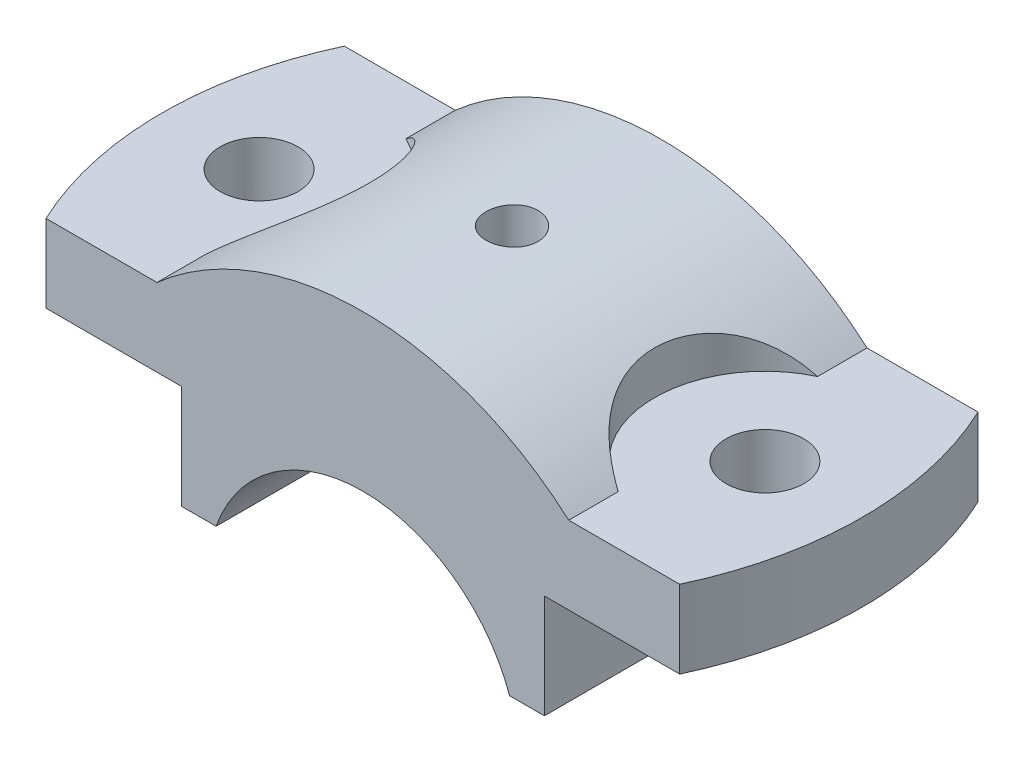
ISO-10303-21;
HEADER;
FILE_DESCRIPTION(('STEP AP214'),'2;1');
FILE_NAME('part.step','',(''),(''),'','','');
FILE_SCHEMA(('AUTOMOTIVE_DESIGN { 1 0 10303 214 1 1 1 1 }'));
ENDSEC;
DATA;
#1=APPLICATION_CONTEXT('core data for automotive mechanical design processes');
#2=APPLICATION_PROTOCOL_DEFINITION('international standard','automotive_design',2000,#1);
#3=PRODUCT_CONTEXT('',#1,'mechanical');
#4=PRODUCT('Part','Part','',(#3));
#5=PRODUCT_RELATED_PRODUCT_CATEGORY('part','',(#4));
#6=PRODUCT_DEFINITION_FORMATION('','',#4);
#7=PRODUCT_DEFINITION_CONTEXT('part definition',#1,'design');
#8=PRODUCT_DEFINITION('design','',#6,#7);
#9=PRODUCT_DEFINITION_SHAPE('','',#8);
#10=(LENGTH_UNIT() NAMED_UNIT(*) SI_UNIT(.MILLI.,.METRE.));
#11=(NAMED_UNIT(*) PLANE_ANGLE_UNIT() SI_UNIT($,.RADIAN.));
#12=(NAMED_UNIT(*) SI_UNIT($,.STERADIAN.) SOLID_ANGLE_UNIT());
#13=UNCERTAINTY_MEASURE_WITH_UNIT(LENGTH_MEASURE(1.E-05),#10,'distance_accuracy_value','');
#14=(GEOMETRIC_REPRESENTATION_CONTEXT(3) GLOBAL_UNCERTAINTY_ASSIGNED_CONTEXT((#13)) GLOBAL_UNIT_ASSIGNED_CONTEXT((#10,
#11,#12)) REPRESENTATION_CONTEXT('',''));
#15=CARTESIAN_POINT('',(0.,0.,0.));
#16=DIRECTION('',(0.,0.,1.));
#17=DIRECTION('',(1.,0.,0.));
#18=AXIS2_PLACEMENT_3D('',#15,#16,#17);
#19=CARTESIAN_POINT('',(0.,-8.,46.));
#20=DIRECTION('',(0.,0.,-1.));
#21=DIRECTION('',(-1.,0.,0.));
#22=AXIS2_PLACEMENT_3D('',#19,#20,#21);
#23=CYLINDRICAL_SURFACE('',#22,48.);
#24=CARTESIAN_POINT('',(0.,40.,27.));
#25=CARTESIAN_POINT('',(-0.224264359684817,39.9999978164606,26.9999902046949));
#26=CARTESIAN_POINT('',(-0.448681388720903,39.9984115417359,26.9810761207558));
#27=CARTESIAN_POINT('',(-0.891306282801559,39.99223609313,26.9059025925797));
#28=CARTESIAN_POINT('',(-1.10950682090092,39.9876435172678,26.8496008387804));
#29=CARTESIAN_POINT('',(-1.53322409005704,39.9759744498442,26.7012913847625));
#30=CARTESIAN_POINT('',(-1.73874792169846,39.9688993639394,26.6093038875607));
#31=CARTESIAN_POINT('',(-2.1313889336643,39.9530587097885,26.392270272512));
#32=CARTESIAN_POINT('',(-2.31851003954155,39.9442935032543,26.26723122609));
#33=CARTESIAN_POINT('',(-2.66955999986236,39.9260311946685,25.987299733576));
#34=CARTESIAN_POINT('',(-2.83343548966465,39.9165324834631,25.8323404642573));
#35=CARTESIAN_POINT('',(-3.13288453414622,39.8978872321267,25.4971084166003));
#36=CARTESIAN_POINT('',(-3.26845684548602,39.8887407074816,25.3168345267895));
#37=CARTESIAN_POINT('',(-3.50763168956091,39.8718181064497,24.9357675316039));
#38=CARTESIAN_POINT('',(-3.61118733180617,39.8640440472037,24.7349448983889));
#39=CARTESIAN_POINT('',(-3.78308973509538,39.8507649779309,24.3186868177761));
#40=CARTESIAN_POINT('',(-3.85143711804967,39.8452599278253,24.103251628567));
#41=CARTESIAN_POINT('',(-3.95082811927428,39.8371556826529,23.6644184324753));
#42=CARTESIAN_POINT('',(-3.9819586615591,39.8345497174488,23.4410402400296));
#43=CARTESIAN_POINT('',(-4.00630083206171,39.832517292859,22.9922151842185));
#44=CARTESIAN_POINT('',(-3.99951317191816,39.8330907738024,22.766768359756));
#45=CARTESIAN_POINT('',(-3.94828345685939,39.8373462944655,22.3208013379579));
#46=CARTESIAN_POINT('',(-3.90393587215223,39.8410205351141,22.1002702036943));
#47=CARTESIAN_POINT('',(-3.77899194153176,39.8510513427746,21.6697925304282));
#48=CARTESIAN_POINT('',(-3.69839524158714,39.857407935984,21.4598460948246));
#49=CARTESIAN_POINT('',(-3.50313515260813,39.8720961882741,21.0561963764876));
#50=CARTESIAN_POINT('',(-3.38842937902877,39.8804303020386,20.86251368965));
#51=CARTESIAN_POINT('',(-3.12823777565339,39.8981322745552,20.4971146447208));
#52=CARTESIAN_POINT('',(-2.98275132249017,39.9075001542413,20.3253987316111));
#53=CARTESIAN_POINT('',(-2.66459832890545,39.9262488164658,20.0082583228737));
#54=CARTESIAN_POINT('',(-2.4918501175623,39.9356295510027,19.862915743483));
#55=CARTESIAN_POINT('',(-2.124362225487,39.9533196747934,19.6032811064458));
#56=CARTESIAN_POINT('',(-1.92962253006135,39.9616290633314,19.4889890695458));
#57=CARTESIAN_POINT('',(-1.5236263730714,39.9762418323856,19.2947049493252));
#58=CARTESIAN_POINT('',(-1.31236816723629,39.9825450006977,19.2147164940874));
#59=CARTESIAN_POINT('',(-0.879356276078326,39.9924326964719,19.0913674701947));
#60=CARTESIAN_POINT('',(-0.657602808675419,39.9960172803554,19.048006141379));
#61=CARTESIAN_POINT('',(-0.210605200657003,40.000056677722,18.9992449438337));
#62=CARTESIAN_POINT('',(0.0146265164607844,40.0005208196801,18.9937319275724));
#63=CARTESIAN_POINT('',(0.462811010013214,39.998291951148,19.0205274425093));
#64=CARTESIAN_POINT('',(0.685763807685653,39.995598970107,19.0528356209178));
#65=CARTESIAN_POINT('',(1.1227390248988,39.9873647136528,19.1542626344404));
#66=CARTESIAN_POINT('',(1.33677370055889,39.9818274966968,19.2233290241032));
#67=CARTESIAN_POINT('',(1.75021666032996,39.968526804494,19.3962583511281));
#68=CARTESIAN_POINT('',(1.94962471313253,39.9607632940497,19.500121838634));
#69=CARTESIAN_POINT('',(2.32866887320763,39.9438570557453,19.7399813968654));
#70=CARTESIAN_POINT('',(2.50825740208588,39.9347111287495,19.8760524255793));
#71=CARTESIAN_POINT('',(2.84208437937449,39.9160783455879,20.1763562282019));
#72=CARTESIAN_POINT('',(2.99632238725753,39.9065914835011,20.3405894913971));
#73=CARTESIAN_POINT('',(3.27545818182041,39.8883184486329,20.6930467687934));
#74=CARTESIAN_POINT('',(3.40028213293455,39.8795340749689,20.8813293647896));
#75=CARTESIAN_POINT('',(3.61654025135807,39.8636860697728,21.2762490514537));
#76=CARTESIAN_POINT('',(3.70797475203985,39.8566224210606,21.4828859588398));
#77=CARTESIAN_POINT('',(3.85473270976226,39.8450257139576,21.908387162157));
#78=CARTESIAN_POINT('',(3.91010136579716,39.8404894891454,22.1272357788573));
#79=CARTESIAN_POINT('',(3.98330307964061,39.834450627634,22.5711627994977));
#80=CARTESIAN_POINT('',(4.00113685827306,39.8329479326787,22.7962410837184));
#81=CARTESIAN_POINT('',(3.99875425156372,39.8331471180078,23.2455045040836));
#82=CARTESIAN_POINT('',(3.97865387910956,39.8348392277228,23.4696902689458));
#83=CARTESIAN_POINT('',(3.90121545318012,39.8412166032923,23.9114901342034));
#84=CARTESIAN_POINT('',(3.84387734291051,39.8459018737118,24.1291042245754));
#85=CARTESIAN_POINT('',(3.69362044006825,39.8577350852682,24.5515910530665));
#86=CARTESIAN_POINT('',(3.60070373602613,39.8648828818476,24.7564645382628));
#87=CARTESIAN_POINT('',(3.381940235789,39.8808359950028,25.1477233622947));
#88=CARTESIAN_POINT('',(3.25609395645823,39.8896412855619,25.3341089912533));
#89=CARTESIAN_POINT('',(2.97460776848979,39.9079492679473,25.683694956052));
#90=CARTESIAN_POINT('',(2.81888197496583,39.9174539202297,25.8468260346294));
#91=CARTESIAN_POINT('',(2.48221290236986,39.9360718003871,26.1447007408133));
#92=CARTESIAN_POINT('',(2.30126353056437,39.945184932993,26.2794374899841));
#93=CARTESIAN_POINT('',(1.91893509211766,39.962009393691,26.5168794416702));
#94=CARTESIAN_POINT('',(1.71751862508215,39.9697180809242,26.6195245546253));
#95=CARTESIAN_POINT('',(1.30038300798293,39.982834100652,26.7894072122051));
#96=CARTESIAN_POINT('',(1.0846806216546,39.9882440771303,26.8566854571524));
#97=CARTESIAN_POINT('',(0.723088192386718,39.994764309354,26.9367903300082));
#98=CARTESIAN_POINT('',(0.579523577753882,39.9967187550781,26.96046245007));
#99=CARTESIAN_POINT('',(0.29066068600465,39.9993373063453,26.9920704387088));
#100=CARTESIAN_POINT('',(0.14536241349218,40.0000014153143,27.0000063490659));
#101=CARTESIAN_POINT('',(0.,40.,27.));
#102=B_SPLINE_CURVE_WITH_KNOTS('',3,(#24,#25,#26,#27,#28,#29,#30,#31,#32,#33,#34,#35,#36,#37,
#38,#39,#40,#41,#42,#43,#44,#45,#46,#47,#48,#49,#50,#51,#52,#53,#54,#55,#56,#57,#58,#59,#60,#61,
#62,#63,#64,#65,#66,#67,#68,#69,#70,#71,#72,#73,#74,#75,#76,#77,#78,#79,#80,#81,#82,#83,#84,#85,
#86,#87,#88,#89,#90,#91,#92,#93,#94,#95,#96,#97,#98,#99,#100,#101),.UNSPECIFIED.,.T.,.F.,(4,2,2,
2,2,2,2,2,2,2,2,2,2,2,2,2,2,2,2,2,2,2,2,2,2,2,2,2,2,2,2,2,2,2,2,2,2,2,4),(0.,0.672262347200557,
1.34528675599134,2.01793069555582,2.69043083833672,3.36445067514306,4.03850011495726,
4.71353211804365,5.38855219711603,6.06199259326345,6.73542035050476,7.40715932441159,
8.07890485907996,8.75148862995597,9.4240860232344,10.098738037406,10.7733905023458,
11.448114303618,12.1228241013014,12.7955159722867,13.4682015685688,14.1399299612314,
14.8116689744549,15.4849869989971,16.15831672285,16.8333190596481,17.5083146567931,
18.1824626896371,18.8565977759503,19.5286745153011,20.2007522796936,20.8727905979009,
21.5448183683942,22.2188075465856,22.8929598092992,23.5683669225021,24.2429950636714,
24.6787394542665,25.1144826879498),.UNSPECIFIED.);
#103=CARTESIAN_POINT('',(0.,40.,27.));
#104=VERTEX_POINT('',#103);
#105=EDGE_CURVE('E189',#104,#104,#102,.T.);
#106=ORIENTED_EDGE('',*,*,#105,.T.);
#107=EDGE_LOOP('',(#106));
#108=FACE_BOUND('',#107,.T.);
#109=DIRECTION('',(0.,0.,-1.));
#110=VECTOR('',#109,1.);
#111=CARTESIAN_POINT('',(-31.7490157327751,28.,46.));
#112=LINE('',#111,#110);
#113=CARTESIAN_POINT('',(-31.7490157327751,28.,7.62393980382305));
#114=VERTEX_POINT('',#113);
#115=CARTESIAN_POINT('',(-31.7490157327751,28.,0.));
#116=VERTEX_POINT('',#115);
#117=EDGE_CURVE('E154',#114,#116,#112,.T.);
#118=ORIENTED_EDGE('',*,*,#117,.F.);
#119=CARTESIAN_POINT('',(-31.7490157327751,28.,7.62393980382304));
#120=CARTESIAN_POINT('',(-31.5666993606049,28.1607910344815,7.70991687292432));
#121=CARTESIAN_POINT('',(-31.3842407385664,28.3192382806885,7.799923567823));
#122=CARTESIAN_POINT('',(-31.0194382984915,28.6312986785064,7.98824476927104));
#123=CARTESIAN_POINT('',(-30.83709449581,28.7849112802083,8.08656021623286));
#124=CARTESIAN_POINT('',(-30.2906545114745,29.2384242405059,8.39444840414579));
#125=CARTESIAN_POINT('',(-29.9273932433293,29.5307855559238,8.61684933510149));
#126=CARTESIAN_POINT('',(-29.2055877678829,30.0952057641667,9.09825010824211));
#127=CARTESIAN_POINT('',(-28.8470773519233,30.3671527207168,9.35743198365531));
#128=CARTESIAN_POINT('',(-28.1414563178619,30.8876660950044,9.91209322117403));
#129=CARTESIAN_POINT('',(-27.7943424142726,31.1362392903486,10.2075620036307));
#130=CARTESIAN_POINT('',(-27.114437272857,31.6103537782901,10.8365659071297));
#131=CARTESIAN_POINT('',(-26.7817440960143,31.8357484531289,11.1703180960102));
#132=CARTESIAN_POINT('',(-26.1381758530123,32.2609560521935,11.8734281889072));
#133=CARTESIAN_POINT('',(-25.8273031949564,32.4607661549158,12.2427900121453));
#134=CARTESIAN_POINT('',(-25.2335249148576,32.8337098769773,13.01399375225));
#135=CARTESIAN_POINT('',(-24.9505424988563,33.0069175240425,13.4157406115368));
#136=CARTESIAN_POINT('',(-24.4165226257608,33.3271148139075,14.2497280213662));
#137=CARTESIAN_POINT('',(-24.1654802670831,33.4741084809499,14.6819638771439));
#138=CARTESIAN_POINT('',(-23.7269538102758,33.7263466257882,15.5212678567218));
#139=CARTESIAN_POINT('',(-23.5354718167671,33.8344606926746,15.9253930890385));
#140=CARTESIAN_POINT('',(-23.1835604410675,34.0305023424913,16.7516546435088));
#141=CARTESIAN_POINT('',(-23.0231288276401,34.1184313759742,17.1737896688415));
#142=CARTESIAN_POINT('',(-22.7354708993116,34.2744033380662,18.0330593307288));
#143=CARTESIAN_POINT('',(-22.608263014144,34.3424352319097,18.4702021408734));
#144=CARTESIAN_POINT('',(-22.3889311500728,34.4588178093571,19.3557653801655));
#145=CARTESIAN_POINT('',(-22.2968060905276,34.5071690991774,19.8041854614902));
#146=CARTESIAN_POINT('',(-22.1535573681311,34.5819913104556,20.6801355748953));
#147=CARTESIAN_POINT('',(-22.1002179585565,34.6096478774008,21.1072039547406));
#148=CARTESIAN_POINT('',(-22.0260840023336,34.6480173220226,21.9648989915092));
#149=CARTESIAN_POINT('',(-22.0052877863416,34.6587310688026,22.3955254647765));
#150=CARTESIAN_POINT('',(-21.9964874817101,34.6632694542849,23.2570337519885));
#151=CARTESIAN_POINT('',(-22.0084707600267,34.6571005994522,23.6879154035977));
#152=CARTESIAN_POINT('',(-22.065059537599,34.6278566152432,24.5469567479689));
#153=CARTESIAN_POINT('',(-22.1096651361626,34.6047814344012,24.9751164324407));
#154=CARTESIAN_POINT('',(-22.2301596888934,34.5420325739506,25.8199476406009));
#155=CARTESIAN_POINT('',(-22.3056259308811,34.5025830752487,26.2366962152239));
#156=CARTESIAN_POINT('',(-22.4869158657054,34.4069464217796,27.0615720498306));
#157=CARTESIAN_POINT('',(-22.5927390819872,34.3507595297616,27.4696994450449));
#158=CARTESIAN_POINT('',(-22.8334963082055,34.2214412118201,28.2745223886822));
#159=CARTESIAN_POINT('',(-22.968430619134,34.1483096106976,28.6712178188572));
#160=CARTESIAN_POINT('',(-23.2658059297839,33.9848905587104,29.4505094660615));
#161=CARTESIAN_POINT('',(-23.4282471429062,33.8946029747475,29.8331055736788));
#162=CARTESIAN_POINT('',(-23.7802108235913,33.6958360657888,30.5849716873719));
#163=CARTESIAN_POINT('',(-23.9699550727257,33.5872063549857,30.9540980563005));
#164=CARTESIAN_POINT('',(-24.3731485080022,33.3521952355227,31.6732437269405));
#165=CARTESIAN_POINT('',(-24.5865977528721,33.2258137828835,32.023262981312));
#166=CARTESIAN_POINT('',(-25.0346129932482,32.9552998874379,32.7022362238959));
#167=CARTESIAN_POINT('',(-25.2691774101921,32.8111687712936,33.0311917836809));
#168=CARTESIAN_POINT('',(-25.7566603032743,32.5052741270816,33.6665029899036));
#169=CARTESIAN_POINT('',(-26.0095789285025,32.3435104557808,33.9728584527217));
#170=CARTESIAN_POINT('',(-26.5418842805158,31.9954208539865,34.574253346598));
#171=CARTESIAN_POINT('',(-26.8219376643438,31.8083462352715,34.8682688661705));
#172=CARTESIAN_POINT('',(-27.3955194624364,31.4158125971757,35.4296869015499));
#173=CARTESIAN_POINT('',(-27.6890490642934,31.2103519560056,35.6970870652737));
#174=CARTESIAN_POINT('',(-28.2863824379904,30.7816416595243,36.205005176795));
#175=CARTESIAN_POINT('',(-28.5901897214681,30.5583858879776,36.4455138130625));
#176=CARTESIAN_POINT('',(-29.2047776474053,30.0950011657592,36.8996257253553));
#177=CARTESIAN_POINT('',(-29.515556781803,29.8548758405909,37.113234755093));
#178=CARTESIAN_POINT('',(-30.1465409740783,29.3543930550497,37.5175420543303));
#179=CARTESIAN_POINT('',(-30.4668164417767,29.0937608790559,37.7077886938376));
#180=CARTESIAN_POINT('',(-31.1079315091615,28.5577863535064,38.0615091701432));
#181=CARTESIAN_POINT('',(-31.4287665224092,28.282490555825,38.2250617322872));
#182=CARTESIAN_POINT('',(-31.7490157327751,28.,38.3760601961769));
#183=B_SPLINE_CURVE_WITH_KNOTS('',3,(#119,#120,#121,#122,#123,#124,#125,#126,#127,#128,#129,
#130,#131,#132,#133,#134,#135,#136,#137,#138,#139,#140,#141,#142,#143,#144,#145,#146,#147,#148,
#149,#150,#151,#152,#153,#154,#155,#156,#157,#158,#159,#160,#161,#162,#163,#164,#165,#166,#167,
#168,#169,#170,#171,#172,#173,#174,#175,#176,#177,#178,#179,#180,#181,#182),.UNSPECIFIED.,.F.,
.F.,(4,2,2,2,2,2,2,2,2,2,2,2,2,2,2,2,2,2,2,2,2,2,2,2,2,2,2,2,2,2,2,4),(0.,0.773458025682369,
1.5470037114875,3.09512332277503,4.65119082007948,6.20680570955184,7.77172305062613,
9.33681282467527,10.8974652129592,12.4578778108564,13.8363264835486,15.2146760660573,
16.5937886249588,17.9728587002062,19.2651269606079,20.5573289303254,21.8490329624022,
23.1407409266611,24.4153187748838,25.6898766154092,26.9644476347566,28.2390285427914,
29.5246179289053,30.8102105000725,32.0957070405173,33.381214024115,34.7209972321288,
36.060898736084,37.4012627703214,38.7413396176214,40.1042161588979,41.4629977344696),.UNSPECIFIED.);
#184=CARTESIAN_POINT('',(-31.7490157327751,28.,38.3760601961769));
#185=VERTEX_POINT('',#184);
#186=EDGE_CURVE('E11',#114,#185,#183,.T.);
#187=ORIENTED_EDGE('',*,*,#186,.T.);
#188=CARTESIAN_POINT('',(-31.7490157327751,28.,46.));
#189=VERTEX_POINT('',#188);
#190=EDGE_CURVE('E151',#189,#185,#112,.T.);
#191=ORIENTED_EDGE('',*,*,#190,.F.);
#192=CARTESIAN_POINT('',(0.,-8.,46.));
#193=DIRECTION('',(0.,0.,1.));
#194=DIRECTION('',(-1.,0.,0.));
#195=AXIS2_PLACEMENT_3D('',#192,#193,#194);
#196=CIRCLE('',#195,48.);
#197=CARTESIAN_POINT('',(31.7490157327751,28.,46.));
#198=VERTEX_POINT('',#197);
#199=EDGE_CURVE('E265',#198,#189,#196,.T.);
#200=ORIENTED_EDGE('',*,*,#199,.F.);
#201=DIRECTION('',(0.,0.,-1.));
#202=VECTOR('',#201,1.);
#203=CARTESIAN_POINT('',(31.7490157327751,28.,46.));
#204=LINE('',#203,#202);
#205=CARTESIAN_POINT('',(31.7490157327751,28.,38.3760601961769));
#206=VERTEX_POINT('',#205);
#207=EDGE_CURVE('E162',#198,#206,#204,.T.);
#208=ORIENTED_EDGE('',*,*,#207,.T.);
#209=CARTESIAN_POINT('',(31.7490157327751,28.,7.62393980382304));
#210=CARTESIAN_POINT('',(31.5666993606049,28.1607910344816,7.70991687292431));
#211=CARTESIAN_POINT('',(31.3842407385664,28.3192382806885,7.79992356782299));
#212=CARTESIAN_POINT('',(31.0194382984914,28.6312986785064,7.98824476927103));
#213=CARTESIAN_POINT('',(30.83709449581,28.7849112802083,8.08656021623285));
#214=CARTESIAN_POINT('',(30.2906545114745,29.2384242405059,8.39444840414578));
#215=CARTESIAN_POINT('',(29.9273932433292,29.5307855559239,8.61684933510148));
#216=CARTESIAN_POINT('',(29.2055877678829,30.0952057641667,9.0982501082421));
#217=CARTESIAN_POINT('',(28.8470773519233,30.3671527207169,9.3574319836553));
#218=CARTESIAN_POINT('',(28.1414563178619,30.8876660950044,9.91209322117402));
#219=CARTESIAN_POINT('',(27.7943424142725,31.1362392903486,10.2075620036307));
#220=CARTESIAN_POINT('',(27.1144372728569,31.6103537782901,10.8365659071297));
#221=CARTESIAN_POINT('',(26.7817440960143,31.8357484531289,11.1703180960102));
#222=CARTESIAN_POINT('',(26.1381758530123,32.2609560521935,11.8734281889072));
#223=CARTESIAN_POINT('',(25.8273031949563,32.4607661549158,12.2427900121453));
#224=CARTESIAN_POINT('',(25.2335249148575,32.8337098769773,13.01399375225));
#225=CARTESIAN_POINT('',(24.9505424988563,33.0069175240426,13.4157406115368));
#226=CARTESIAN_POINT('',(24.4165226257608,33.3271148139075,14.2497280213662));
#227=CARTESIAN_POINT('',(24.165480267083,33.4741084809499,14.6819638771439));
#228=CARTESIAN_POINT('',(23.7269538102758,33.7263466257883,15.5212678567218));
#229=CARTESIAN_POINT('',(23.535471816767,33.8344606926746,15.9253930890385));
#230=CARTESIAN_POINT('',(23.1835604410674,34.0305023424913,16.7516546435088));
#231=CARTESIAN_POINT('',(23.0231288276401,34.1184313759742,17.1737896688415));
#232=CARTESIAN_POINT('',(22.7354708993115,34.2744033380662,18.0330593307288));
#233=CARTESIAN_POINT('',(22.608263014144,34.3424352319097,18.4702021408734));
#234=CARTESIAN_POINT('',(22.3889311500727,34.4588178093571,19.3557653801655));
#235=CARTESIAN_POINT('',(22.2968060905276,34.5071690991774,19.8041854614902));
#236=CARTESIAN_POINT('',(22.1535573681311,34.5819913104556,20.6801355748953));
#237=CARTESIAN_POINT('',(22.1002179585565,34.6096478774008,21.1072039547406));
#238=CARTESIAN_POINT('',(22.0260840023336,34.6480173220226,21.9648989915092));
#239=CARTESIAN_POINT('',(22.0052877863416,34.6587310688027,22.3955254647765));
#240=CARTESIAN_POINT('',(21.9964874817101,34.6632694542849,23.2570337519885));
#241=CARTESIAN_POINT('',(22.0084707600267,34.6571005994522,23.6879154035977));
#242=CARTESIAN_POINT('',(22.065059537599,34.6278566152432,24.5469567479689));
#243=CARTESIAN_POINT('',(22.1096651361626,34.6047814344012,24.9751164324407));
#244=CARTESIAN_POINT('',(22.2301596888934,34.5420325739506,25.8199476406009));
#245=CARTESIAN_POINT('',(22.305625930881,34.5025830752487,26.2366962152239));
#246=CARTESIAN_POINT('',(22.4869158657054,34.4069464217796,27.0615720498306));
#247=CARTESIAN_POINT('',(22.5927390819871,34.3507595297616,27.4696994450449));
#248=CARTESIAN_POINT('',(22.8334963082055,34.2214412118201,28.2745223886822));
#249=CARTESIAN_POINT('',(22.968430619134,34.1483096106976,28.6712178188572));
#250=CARTESIAN_POINT('',(23.2658059297839,33.9848905587104,29.4505094660615));
#251=CARTESIAN_POINT('',(23.4282471429062,33.8946029747475,29.8331055736788));
#252=CARTESIAN_POINT('',(23.7802108235912,33.6958360657888,30.5849716873719));
#253=CARTESIAN_POINT('',(23.9699550727257,33.5872063549857,30.9540980563005));
#254=CARTESIAN_POINT('',(24.3731485080021,33.3521952355227,31.6732437269405));
#255=CARTESIAN_POINT('',(24.5865977528721,33.2258137828836,32.023262981312));
#256=CARTESIAN_POINT('',(25.0346129932482,32.955299887438,32.7022362238959));
#257=CARTESIAN_POINT('',(25.269177410192,32.8111687712936,33.0311917836809));
#258=CARTESIAN_POINT('',(25.7566603032743,32.5052741270816,33.6665029899036));
#259=CARTESIAN_POINT('',(26.0095789285024,32.3435104557808,33.9728584527217));
#260=CARTESIAN_POINT('',(26.5418842805157,31.9954208539865,34.574253346598));
#261=CARTESIAN_POINT('',(26.8219376643438,31.8083462352715,34.8682688661705));
#262=CARTESIAN_POINT('',(27.3955194624364,31.4158125971757,35.4296869015499));
#263=CARTESIAN_POINT('',(27.6890490642933,31.2103519560057,35.6970870652737));
#264=CARTESIAN_POINT('',(28.2863824379903,30.7816416595243,36.205005176795));
#265=CARTESIAN_POINT('',(28.5901897214681,30.5583858879776,36.4455138130625));
#266=CARTESIAN_POINT('',(29.2047776474053,30.0950011657593,36.8996257253554));
#267=CARTESIAN_POINT('',(29.515556781803,29.8548758405909,37.113234755093));
#268=CARTESIAN_POINT('',(30.1465409740783,29.3543930550497,37.5175420543303));
#269=CARTESIAN_POINT('',(30.4668164417767,29.0937608790559,37.7077886938376));
#270=CARTESIAN_POINT('',(31.1079315091614,28.5577863535064,38.0615091701432));
#271=CARTESIAN_POINT('',(31.4287665224091,28.282490555825,38.2250617322872));
#272=CARTESIAN_POINT('',(31.7490157327751,28.,38.3760601961769));
#273=B_SPLINE_CURVE_WITH_KNOTS('',3,(#209,#210,#211,#212,#213,#214,#215,#216,#217,#218,#219,
#220,#221,#222,#223,#224,#225,#226,#227,#228,#229,#230,#231,#232,#233,#234,#235,#236,#237,#238,
#239,#240,#241,#242,#243,#244,#245,#246,#247,#248,#249,#250,#251,#252,#253,#254,#255,#256,#257,
#258,#259,#260,#261,#262,#263,#264,#265,#266,#267,#268,#269,#270,#271,#272),.UNSPECIFIED.,.F.,
.F.,(4,2,2,2,2,2,2,2,2,2,2,2,2,2,2,2,2,2,2,2,2,2,2,2,2,2,2,2,2,2,2,4),(0.,0.77345802568237,
1.5470037114875,3.09512332277503,4.65119082007948,6.20680570955184,7.77172305062615,
9.33681282467529,10.8974652129592,12.4578778108564,13.8363264835486,15.2146760660573,
16.5937886249588,17.9728587002062,19.2651269606079,20.5573289303254,21.8490329624022,
23.1407409266611,24.4153187748839,25.6898766154092,26.9644476347566,28.2390285427914,
29.5246179289053,30.8102105000726,32.0957070405173,33.381214024115,34.7209972321288,
36.060898736084,37.4012627703214,38.7413396176214,40.104216158898,41.4629977344696),.UNSPECIFIED.);
#274=CARTESIAN_POINT('',(31.7490157327751,28.,7.62393980382304));
#275=VERTEX_POINT('',#274);
#276=EDGE_CURVE('E52',#275,#206,#273,.T.);
#277=ORIENTED_EDGE('',*,*,#276,.F.);
#278=CARTESIAN_POINT('',(31.7490157327751,28.,0.));
#279=VERTEX_POINT('',#278);
#280=EDGE_CURVE('E160',#275,#279,#204,.T.);
#281=ORIENTED_EDGE('',*,*,#280,.T.);
#282=CARTESIAN_POINT('',(0.,-8.,0.));
#283=DIRECTION('',(0.,0.,1.));
#284=DIRECTION('',(-1.,0.,0.));
#285=AXIS2_PLACEMENT_3D('',#282,#283,#284);
#286=CIRCLE('',#285,48.);
#287=EDGE_CURVE('E287',#279,#116,#286,.T.);
#288=ORIENTED_EDGE('',*,*,#287,.T.);
#289=EDGE_LOOP('',(#118,#187,#191,#200,#208,#277,#281,#288));
#290=FACE_BOUND('',#289,.T.);
#291=ADVANCED_FACE('F37',(#108,#290),#23,.T.);
#292=CARTESIAN_POINT('',(0.,0.,23.));
#293=DIRECTION('',(0.,1.,0.));
#294=DIRECTION('',(0.,0.,1.));
#295=AXIS2_PLACEMENT_3D('',#292,#293,#294);
#296=CYLINDRICAL_SURFACE('',#295,3.);
#297=CARTESIAN_POINT('',(0.,16.,26.));
#298=CARTESIAN_POINT('',(0.167809314666914,15.9999976587571,25.9999928708771));
#299=CARTESIAN_POINT('',(0.335723489163296,15.9982214146588,25.9858725449969));
#300=CARTESIAN_POINT('',(0.666879362507703,15.9913064813363,25.929766694515));
#301=CARTESIAN_POINT('',(0.830115996748493,15.9861642812971,25.8877520744919));
#302=CARTESIAN_POINT('',(1.14707468977566,15.9730967325329,25.7771148273031));
#303=CARTESIAN_POINT('',(1.30080307217537,15.9651732574665,25.7085101098282));
#304=CARTESIAN_POINT('',(1.59453536987164,15.9474244105372,25.5466792592362));
#305=CARTESIAN_POINT('',(1.73454163386764,15.9375993650094,25.4534573497631));
#306=CARTESIAN_POINT('',(1.99765538031758,15.9170838556759,25.2444896601925));
#307=CARTESIAN_POINT('',(2.12067643792455,15.906389376309,25.1286354447845));
#308=CARTESIAN_POINT('',(2.34558335226899,15.885372712117,24.877924611756));
#309=CARTESIAN_POINT('',(2.4474681316707,15.8750505462912,24.7430670261041));
#310=CARTESIAN_POINT('',(2.62753219354073,15.855907667435,24.4576160269212));
#311=CARTESIAN_POINT('',(2.70563051512928,15.8470921261349,24.3069711661185));
#312=CARTESIAN_POINT('',(2.83538769189014,15.8320135414922,23.9945755376632));
#313=CARTESIAN_POINT('',(2.88704754967826,15.8257504013576,23.8328251914236));
#314=CARTESIAN_POINT('',(2.96219877602972,15.8165240752434,23.5037069652959));
#315=CARTESIAN_POINT('',(2.98583605767804,15.8135438012409,23.336372890755));
#316=CARTESIAN_POINT('',(3.00472265946868,15.8111683377135,23.0000884838338));
#317=CARTESIAN_POINT('',(2.9999731212029,15.8117730040181,22.8311382167225));
#318=CARTESIAN_POINT('',(2.96234068373748,15.816483464437,22.4974342073015));
#319=CARTESIAN_POINT('',(2.92961851558164,15.8205692555239,22.3326620165597));
#320=CARTESIAN_POINT('',(2.83722045981846,15.8317503970915,22.0109659745372));
#321=CARTESIAN_POINT('',(2.77754402610228,15.8388458085487,21.8540422823431));
#322=CARTESIAN_POINT('',(2.63275867189398,15.8552693903758,21.551998401174));
#323=CARTESIAN_POINT('',(2.54757990444916,15.8646036785373,21.4069120397012));
#324=CARTESIAN_POINT('',(2.3542577633483,15.8844485371672,21.1330319667041));
#325=CARTESIAN_POINT('',(2.24611333929693,15.8949591614279,21.0042390008316));
#326=CARTESIAN_POINT('',(2.00903893290454,15.9160613186851,20.7656687471327));
#327=CARTESIAN_POINT('',(1.87997040940802,15.9266529086427,20.6560290898808));
#328=CARTESIAN_POINT('',(1.60518860293671,15.9466555906702,20.4599493439633));
#329=CARTESIAN_POINT('',(1.4594752815819,15.9560666800181,20.3735093087936));
#330=CARTESIAN_POINT('',(1.15543400563618,15.972653826623,20.2262824154433));
#331=CARTESIAN_POINT('',(0.997101834405263,15.9798291328184,20.1655041753425));
#332=CARTESIAN_POINT('',(0.672369528517271,15.9911294293607,20.0714354077721));
#333=CARTESIAN_POINT('',(0.505969771956804,15.9952545625104,20.0381435934355));
#334=CARTESIAN_POINT('',(0.1710157966962,15.9999711569291,20.0001710908873));
#335=CARTESIAN_POINT('',(0.00248338823833122,16.0005860337116,19.9953008091631));
#336=CARTESIAN_POINT('',(-0.332995243796993,15.9982760560652,20.0138092808671));
#337=CARTESIAN_POINT('',(-0.499941501077645,15.9953512770186,20.0371874327019));
#338=CARTESIAN_POINT('',(-0.826949409265824,15.9863052250803,20.1113716505293));
#339=CARTESIAN_POINT('',(-0.987031884509645,15.9801944897664,20.1620873160832));
#340=CARTESIAN_POINT('',(-1.29641958583009,15.9654606772024,20.2894129422955));
#341=CARTESIAN_POINT('',(-1.44572444575837,15.9568375146475,20.3660237821897));
#342=CARTESIAN_POINT('',(-1.73016542482491,15.9379818749213,20.5434237650089));
#343=CARTESIAN_POINT('',(-1.86522451193258,15.9277413285101,20.6443355477668));
#344=CARTESIAN_POINT('',(-2.11655638755158,15.9068217079079,20.867299397041));
#345=CARTESIAN_POINT('',(-2.23282843000423,15.8961426163228,20.9893523027012));
#346=CARTESIAN_POINT('',(-2.44395835058162,15.875477265551,21.2519689001086));
#347=CARTESIAN_POINT('',(-2.53869055268152,15.8654952966559,21.3926340155725));
#348=CARTESIAN_POINT('',(-2.70318346733221,15.8474249324458,21.6879898938257));
#349=CARTESIAN_POINT('',(-2.77294468047404,15.8393364991723,21.8426803753718));
#350=CARTESIAN_POINT('',(-2.88531189463985,15.8259982047159,22.1612903829771));
#351=CARTESIAN_POINT('',(-2.92798875294853,15.8207409422175,22.3251845960576));
#352=CARTESIAN_POINT('',(-2.98520399264142,15.8136389908895,22.6578829805368));
#353=CARTESIAN_POINT('',(-2.99974368304292,15.8117941433053,22.8266869231508));
#354=CARTESIAN_POINT('',(-3.0002478433018,15.8117305237895,23.1631627150456));
#355=CARTESIAN_POINT('',(-2.98640975723913,15.8134866970234,23.3308342979983));
#356=CARTESIAN_POINT('',(-2.93096928581919,15.8203733744464,23.6614485552141));
#357=CARTESIAN_POINT('',(-2.88936689748692,15.825503878997,23.8243912289706));
#358=CARTESIAN_POINT('',(-2.77964048842759,15.8385533892946,24.1408963481197));
#359=CARTESIAN_POINT('',(-2.71152597716512,15.8464713951134,24.2944621340262));
#360=CARTESIAN_POINT('',(-2.55072828258037,15.8642053989378,24.588015984858));
#361=CARTESIAN_POINT('',(-2.45804479141151,15.874021420725,24.7280038796238));
#362=CARTESIAN_POINT('',(-2.25000759751901,15.8945272570268,24.9914374704086));
#363=CARTESIAN_POINT('',(-2.13450675092995,15.9052224650084,25.114766553146));
#364=CARTESIAN_POINT('',(-1.88442027236206,15.9262339791148,25.3403681902016));
#365=CARTESIAN_POINT('',(-1.74983014696988,15.9365501953071,25.4426357729292));
#366=CARTESIAN_POINT('',(-1.46479874502505,15.955684679041,25.6235424285263));
#367=CARTESIAN_POINT('',(-1.31429913551541,15.9644971009396,25.7020901670791));
#368=CARTESIAN_POINT('',(-1.00221948276154,15.9795717889207,25.8326854914995));
#369=CARTESIAN_POINT('',(-0.840651697044285,15.9858368244349,25.8847618716241));
#370=CARTESIAN_POINT('',(-0.565206926361511,15.993600643933,25.9484712058056));
#371=CARTESIAN_POINT('',(-0.453066796220306,15.9959887107454,25.9677667303785));
#372=CARTESIAN_POINT('',(-0.227300475854922,15.9991891759503,25.9935334948319));
#373=CARTESIAN_POINT('',(-0.113674296595233,16.0000015859616,26.0000048292792));
#374=CARTESIAN_POINT('',(0.,16.,26.));
#375=B_SPLINE_CURVE_WITH_KNOTS('',3,(#297,#298,#299,#300,#301,#302,#303,#304,#305,#306,#307,
#308,#309,#310,#311,#312,#313,#314,#315,#316,#317,#318,#319,#320,#321,#322,#323,#324,#325,#326,
#327,#328,#329,#330,#331,#332,#333,#334,#335,#336,#337,#338,#339,#340,#341,#342,#343,#344,#345,
#346,#347,#348,#349,#350,#351,#352,#353,#354,#355,#356,#357,#358,#359,#360,#361,#362,#363,#364,
#365,#366,#367,#368,#369,#370,#371,#372,#373,#374),.UNSPECIFIED.,.T.,.F.,(4,2,2,2,2,2,2,2,2,2,2,
2,2,2,2,2,2,2,2,2,2,2,2,2,2,2,2,2,2,2,2,2,2,2,2,2,2,2,4),(0.,0.503012727331496,1.00655095313211,
1.50975060981812,2.01286398709288,2.51844975842212,3.02406129360013,3.53137500382643,
4.03866947396168,4.54331070343585,5.04793163861596,5.54967235730031,6.05142324199489,
6.5545611154264,7.05772200616366,7.564361737637,8.07100263735736,8.57781354877926,
9.08460073084536,9.58800335270305,10.0913952540231,10.5931326467207,11.0948870769474,
11.5992288351411,12.1035906165011,12.6108236580909,13.1180465306585,13.6239368913711,
14.1298037161275,14.6321628144266,15.1345219665546,15.6367010964779,16.1388865189472,
16.644422852302,17.1500783816401,17.6576568364422,18.1646819842084,18.5054261182515,
18.8461677396052),.UNSPECIFIED.);
#376=CARTESIAN_POINT('',(0.,16.,26.));
#377=VERTEX_POINT('',#376);
#378=EDGE_CURVE('E198',#377,#377,#375,.T.);
#379=ORIENTED_EDGE('',*,*,#378,.F.);
#380=EDGE_LOOP('',(#379));
#381=FACE_BOUND('',#380,.T.);
#382=CARTESIAN_POINT('',(0.,24.,23.));
#383=DIRECTION('',(0.,1.,0.));
#384=DIRECTION('',(0.,0.,1.));
#385=AXIS2_PLACEMENT_3D('',#382,#383,#384);
#386=CIRCLE('',#385,3.);
#387=CARTESIAN_POINT('',(0.,24.,26.));
#388=VERTEX_POINT('',#387);
#389=EDGE_CURVE('E195',#388,#388,#386,.F.);
#390=ORIENTED_EDGE('',*,*,#389,.F.);
#391=EDGE_LOOP('',(#390));
#392=FACE_BOUND('',#391,.T.);
#393=ADVANCED_FACE('F220',(#381,#392),#296,.F.);
#394=CARTESIAN_POINT('',(28.,16.,46.));
#395=DIRECTION('',(0.,1.,0.));
#396=DIRECTION('',(0.,0.,1.));
#397=AXIS2_PLACEMENT_3D('',#394,#395,#396);
#398=PLANE('',#397);
#399=CARTESIAN_POINT('',(39.,16.,23.));
#400=DIRECTION('',(0.,1.,0.));
#401=DIRECTION('',(0.,0.,1.));
#402=AXIS2_PLACEMENT_3D('',#399,#400,#401);
#403=CIRCLE('',#402,5.99999999999999);
#404=CARTESIAN_POINT('',(39.,16.,29.));
#405=VERTEX_POINT('',#404);
#406=EDGE_CURVE('E193',#405,#405,#403,.T.);
#407=ORIENTED_EDGE('',*,*,#406,.T.);
#408=EDGE_LOOP('',(#407));
#409=FACE_BOUND('',#408,.T.);
#410=DIRECTION('',(1.,0.,0.));
#411=VECTOR('',#410,1.);
#412=CARTESIAN_POINT('',(28.,16.,0.));
#413=LINE('',#412,#411);
#414=CARTESIAN_POINT('',(28.,16.,0.));
#415=VERTEX_POINT('',#414);
#416=CARTESIAN_POINT('',(48.8569340012244,16.,0.));
#417=VERTEX_POINT('',#416);
#418=EDGE_CURVE('E281',#415,#417,#413,.T.);
#419=ORIENTED_EDGE('',*,*,#418,.T.);
#420=CARTESIAN_POINT('',(0.,16.,23.));
#421=DIRECTION('',(0.,1.,0.));
#422=DIRECTION('',(0.,0.,1.));
#423=AXIS2_PLACEMENT_3D('',#420,#421,#422);
#424=CIRCLE('',#423,54.);
#425=CARTESIAN_POINT('',(48.8569340012244,16.,46.));
#426=VERTEX_POINT('',#425);
#427=EDGE_CURVE('E248',#417,#426,#424,.F.);
#428=ORIENTED_EDGE('',*,*,#427,.T.);
#429=DIRECTION('',(1.,0.,0.));
#430=VECTOR('',#429,1.);
#431=CARTESIAN_POINT('',(28.,16.,46.));
#432=LINE('',#431,#430);
#433=CARTESIAN_POINT('',(28.,16.,46.));
#434=VERTEX_POINT('',#433);
#435=EDGE_CURVE('E260',#434,#426,#432,.T.);
#436=ORIENTED_EDGE('',*,*,#435,.F.);
#437=DIRECTION('',(0.,0.,-1.));
#438=VECTOR('',#437,1.);
#439=CARTESIAN_POINT('',(28.,16.,46.));
#440=LINE('',#439,#438);
#441=EDGE_CURVE('E169',#434,#415,#440,.T.);
#442=ORIENTED_EDGE('',*,*,#441,.T.);
#443=EDGE_LOOP('',(#419,#428,#436,#442));
#444=FACE_BOUND('',#443,.T.);
#445=ADVANCED_FACE('F224',(#409,#444),#398,.F.);
#446=CARTESIAN_POINT('',(54.,28.,46.));
#447=DIRECTION('',(0.,-1.,0.));
#448=DIRECTION('',(1.,0.,0.));
#449=AXIS2_PLACEMENT_3D('',#446,#447,#448);
#450=PLANE('',#449);
#451=CARTESIAN_POINT('',(39.,28.,23.));
#452=DIRECTION('',(0.,1.,0.));
#453=DIRECTION('',(-1.,0.,0.));
#454=AXIS2_PLACEMENT_3D('',#451,#452,#453);
#455=CIRCLE('',#454,5.99999999999999);
#456=CARTESIAN_POINT('',(33.,28.,23.));
#457=VERTEX_POINT('',#456);
#458=EDGE_CURVE('E194',#457,#457,#455,.T.);
#459=ORIENTED_EDGE('',*,*,#458,.F.);
#460=EDGE_LOOP('',(#459));
#461=FACE_BOUND('',#460,.T.);
#462=CARTESIAN_POINT('',(0.,28.,23.));
#463=DIRECTION('',(0.,1.,0.));
#464=DIRECTION('',(-1.,0.,0.));
#465=AXIS2_PLACEMENT_3D('',#462,#463,#464);
#466=CIRCLE('',#465,54.);
#467=CARTESIAN_POINT('',(48.8569340012244,28.,0.));
#468=VERTEX_POINT('',#467);
#469=CARTESIAN_POINT('',(48.8569340012244,28.,46.));
#470=VERTEX_POINT('',#469);
#471=EDGE_CURVE('E243',#468,#470,#466,.F.);
#472=ORIENTED_EDGE('',*,*,#471,.F.);
#473=DIRECTION('',(-1.,0.,0.));
#474=VECTOR('',#473,1.);
#475=CARTESIAN_POINT('',(54.,28.,0.));
#476=LINE('',#475,#474);
#477=EDGE_CURVE('E284',#468,#279,#476,.T.);
#478=ORIENTED_EDGE('',*,*,#477,.T.);
#479=ORIENTED_EDGE('',*,*,#280,.F.);
#480=CARTESIAN_POINT('',(39.,28.,23.));
#481=DIRECTION('',(0.,1.,0.));
#482=DIRECTION('',(-1.,0.,0.));
#483=AXIS2_PLACEMENT_3D('',#480,#481,#482);
#484=CIRCLE('',#483,17.);
#485=EDGE_CURVE('E59',#275,#206,#484,.T.);
#486=ORIENTED_EDGE('',*,*,#485,.T.);
#487=ORIENTED_EDGE('',*,*,#207,.F.);
#488=DIRECTION('',(-1.,0.,0.));
#489=VECTOR('',#488,1.);
#490=CARTESIAN_POINT('',(54.,28.,46.));
#491=LINE('',#490,#489);
#492=EDGE_CURVE('E263',#470,#198,#491,.T.);
#493=ORIENTED_EDGE('',*,*,#492,.F.);
#494=EDGE_LOOP('',(#472,#478,#479,#486,#487,#493));
#495=FACE_BOUND('',#494,.T.);
#496=ADVANCED_FACE('F334',(#461,#495),#450,.F.);
#497=CARTESIAN_POINT('',(-54.,28.,46.));
#498=DIRECTION('',(0.,-1.,0.));
#499=DIRECTION('',(1.,0.,0.));
#500=AXIS2_PLACEMENT_3D('',#497,#498,#499);
#501=PLANE('',#500);
#502=CARTESIAN_POINT('',(-39.,28.,23.));
#503=DIRECTION('',(0.,1.,0.));
#504=DIRECTION('',(1.,0.,0.));
#505=AXIS2_PLACEMENT_3D('',#502,#503,#504);
#506=CIRCLE('',#505,6.00000000000001);
#507=CARTESIAN_POINT('',(-33.,28.,23.));
#508=VERTEX_POINT('',#507);
#509=EDGE_CURVE('E234',#508,#508,#506,.T.);
#510=ORIENTED_EDGE('',*,*,#509,.F.);
#511=EDGE_LOOP('',(#510));
#512=FACE_BOUND('',#511,.T.);
#513=DIRECTION('',(-1.,0.,0.));
#514=VECTOR('',#513,1.);
#515=CARTESIAN_POINT('',(-54.,28.,0.));
#516=LINE('',#515,#514);
#517=CARTESIAN_POINT('',(-48.8569340012244,28.,0.));
#518=VERTEX_POINT('',#517);
#519=EDGE_CURVE('E289',#116,#518,#516,.T.);
#520=ORIENTED_EDGE('',*,*,#519,.T.);
#521=CARTESIAN_POINT('',(0.,28.,23.));
#522=DIRECTION('',(0.,1.,0.));
#523=DIRECTION('',(-1.,0.,0.));
#524=AXIS2_PLACEMENT_3D('',#521,#522,#523);
#525=CIRCLE('',#524,54.);
#526=CARTESIAN_POINT('',(-48.8569340012244,28.,46.));
#527=VERTEX_POINT('',#526);
#528=EDGE_CURVE('E242',#518,#527,#525,.T.);
#529=ORIENTED_EDGE('',*,*,#528,.T.);
#530=DIRECTION('',(-1.,0.,0.));
#531=VECTOR('',#530,1.);
#532=CARTESIAN_POINT('',(-54.,28.,46.));
#533=LINE('',#532,#531);
#534=EDGE_CURVE('E159',#189,#527,#533,.T.);
#535=ORIENTED_EDGE('',*,*,#534,.F.);
#536=ORIENTED_EDGE('',*,*,#190,.T.);
#537=CARTESIAN_POINT('',(-39.,28.,23.));
#538=DIRECTION('',(0.,1.,0.));
#539=DIRECTION('',(-1.,0.,0.));
#540=AXIS2_PLACEMENT_3D('',#537,#538,#539);
#541=CIRCLE('',#540,17.);
#542=EDGE_CURVE('E67',#114,#185,#541,.F.);
#543=ORIENTED_EDGE('',*,*,#542,.F.);
#544=ORIENTED_EDGE('',*,*,#117,.T.);
#545=EDGE_LOOP('',(#520,#529,#535,#536,#543,#544));
#546=FACE_BOUND('',#545,.T.);
#547=ADVANCED_FACE('F156',(#512,#546),#501,.F.);
#548=CARTESIAN_POINT('',(-28.,16.0057912692254,46.));
#549=DIRECTION('',(0.,1.,0.));
#550=DIRECTION('',(0.,0.,1.));
#551=AXIS2_PLACEMENT_3D('',#548,#549,#550);
#552=PLANE('',#551);
#553=CARTESIAN_POINT('',(-39.,16.0057912692254,23.));
#554=DIRECTION('',(0.,1.,0.));
#555=DIRECTION('',(0.,0.,1.));
#556=AXIS2_PLACEMENT_3D('',#553,#554,#555);
#557=CIRCLE('',#556,6.00000000000001);
#558=CARTESIAN_POINT('',(-39.,16.0057912692254,29.));
#559=VERTEX_POINT('',#558);
#560=EDGE_CURVE('E190',#559,#559,#557,.T.);
#561=ORIENTED_EDGE('',*,*,#560,.T.);
#562=EDGE_LOOP('',(#561));
#563=FACE_BOUND('',#562,.T.);
#564=CARTESIAN_POINT('',(0.,16.0057912692254,23.));
#565=DIRECTION('',(0.,1.,0.));
#566=DIRECTION('',(0.,0.,1.));
#567=AXIS2_PLACEMENT_3D('',#564,#565,#566);
#568=CIRCLE('',#567,54.);
#569=CARTESIAN_POINT('',(-48.8569340012244,16.0057912692254,0.));
#570=VERTEX_POINT('',#569);
#571=CARTESIAN_POINT('',(-48.8569340012244,16.0057912692254,46.));
#572=VERTEX_POINT('',#571);
#573=EDGE_CURVE('E245',#570,#572,#568,.T.);
#574=ORIENTED_EDGE('',*,*,#573,.F.);
#575=DIRECTION('',(1.,0.,0.));
#576=VECTOR('',#575,1.);
#577=CARTESIAN_POINT('',(-28.,16.0057912692254,0.));
#578=LINE('',#577,#576);
#579=CARTESIAN_POINT('',(-28.,16.0057912692254,0.));
#580=VERTEX_POINT('',#579);
#581=EDGE_CURVE('E291',#570,#580,#578,.T.);
#582=ORIENTED_EDGE('',*,*,#581,.T.);
#583=DIRECTION('',(0.,0.,-1.));
#584=VECTOR('',#583,1.);
#585=CARTESIAN_POINT('',(-28.,16.0057912692254,46.));
#586=LINE('',#585,#584);
#587=CARTESIAN_POINT('',(-28.,16.0057912692254,46.));
#588=VERTEX_POINT('',#587);
#589=EDGE_CURVE('E164',#588,#580,#586,.T.);
#590=ORIENTED_EDGE('',*,*,#589,.F.);
#591=DIRECTION('',(1.,0.,0.));
#592=VECTOR('',#591,1.);
#593=CARTESIAN_POINT('',(-28.,16.0057912692254,46.));
#594=LINE('',#593,#592);
#595=EDGE_CURVE('E268',#572,#588,#594,.T.);
#596=ORIENTED_EDGE('',*,*,#595,.F.);
#597=EDGE_LOOP('',(#574,#582,#590,#596));
#598=FACE_BOUND('',#597,.T.);
#599=ADVANCED_FACE('F325',(#563,#598),#552,.F.);
#600=CARTESIAN_POINT('',(0.,-8.,0.));
#601=DIRECTION('',(0.,0.,-1.));
#602=DIRECTION('',(-1.,0.,0.));
#603=AXIS2_PLACEMENT_3D('',#600,#601,#602);
#604=PLANE('',#603);
#605=DIRECTION('',(0.,1.,0.));
#606=VECTOR('',#605,1.);
#607=CARTESIAN_POINT('',(48.8569340012244,0.,0.));
#608=LINE('',#607,#606);
#609=EDGE_CURVE('E186',#417,#468,#608,.T.);
#610=ORIENTED_EDGE('',*,*,#609,.F.);
#611=ORIENTED_EDGE('',*,*,#418,.F.);
#612=DIRECTION('',(0.,1.,0.));
#613=VECTOR('',#612,1.);
#614=CARTESIAN_POINT('',(28.,0.,0.));
#615=LINE('',#614,#613);
#616=CARTESIAN_POINT('',(28.,0.,0.));
#617=VERTEX_POINT('',#616);
#618=EDGE_CURVE('E279',#617,#415,#615,.T.);
#619=ORIENTED_EDGE('',*,*,#618,.F.);
#620=DIRECTION('',(1.,0.,0.));
#621=VECTOR('',#620,1.);
#622=CARTESIAN_POINT('',(22.6274169979695,0.,0.));
#623=LINE('',#622,#621);
#624=CARTESIAN_POINT('',(22.6274169979695,0.,0.));
#625=VERTEX_POINT('',#624);
#626=EDGE_CURVE('E277',#625,#617,#623,.T.);
#627=ORIENTED_EDGE('',*,*,#626,.F.);
#628=CARTESIAN_POINT('',(0.,-8.,0.));
#629=DIRECTION('',(0.,0.,-1.));
#630=DIRECTION('',(-1.,0.,0.));
#631=AXIS2_PLACEMENT_3D('',#628,#629,#630);
#632=CIRCLE('',#631,24.);
#633=CARTESIAN_POINT('',(-22.6274169979695,0.,0.));
#634=VERTEX_POINT('',#633);
#635=EDGE_CURVE('E251',#634,#625,#632,.T.);
#636=ORIENTED_EDGE('',*,*,#635,.F.);
#637=DIRECTION('',(1.,0.,0.));
#638=VECTOR('',#637,1.);
#639=CARTESIAN_POINT('',(-22.6274169979695,0.,0.));
#640=LINE('',#639,#638);
#641=CARTESIAN_POINT('',(-28.,0.,0.));
#642=VERTEX_POINT('',#641);
#643=EDGE_CURVE('E256',#642,#634,#640,.T.);
#644=ORIENTED_EDGE('',*,*,#643,.F.);
#645=DIRECTION('',(0.,-1.,0.));
#646=VECTOR('',#645,1.);
#647=CARTESIAN_POINT('',(-28.,0.,0.));
#648=LINE('',#647,#646);
#649=EDGE_CURVE('E293',#580,#642,#648,.T.);
#650=ORIENTED_EDGE('',*,*,#649,.F.);
#651=ORIENTED_EDGE('',*,*,#581,.F.);
#652=DIRECTION('',(0.,1.,0.));
#653=VECTOR('',#652,1.);
#654=CARTESIAN_POINT('',(-48.8569340012244,0.,0.));
#655=LINE('',#654,#653);
#656=EDGE_CURVE('E183',#570,#518,#655,.T.);
#657=ORIENTED_EDGE('',*,*,#656,.T.);
#658=ORIENTED_EDGE('',*,*,#519,.F.);
#659=ORIENTED_EDGE('',*,*,#287,.F.);
#660=ORIENTED_EDGE('',*,*,#477,.F.);
#661=EDGE_LOOP('',(#610,#611,#619,#627,#636,#644,#650,#651,#657,#658,#659,#660));
#662=FACE_BOUND('',#661,.T.);
#663=ADVANCED_FACE('F314',(#662),#604,.T.);
#664=CARTESIAN_POINT('',(0.,-8.,46.));
#665=DIRECTION('',(0.,0.,-1.));
#666=DIRECTION('',(-1.,0.,0.));
#667=AXIS2_PLACEMENT_3D('',#664,#665,#666);
#668=PLANE('',#667);
#669=ORIENTED_EDGE('',*,*,#435,.T.);
#670=DIRECTION('',(0.,1.,0.));
#671=VECTOR('',#670,1.);
#672=CARTESIAN_POINT('',(48.8569340012244,0.,46.));
#673=LINE('',#672,#671);
#674=EDGE_CURVE('E180',#426,#470,#673,.T.);
#675=ORIENTED_EDGE('',*,*,#674,.T.);
#676=ORIENTED_EDGE('',*,*,#492,.T.);
#677=ORIENTED_EDGE('',*,*,#199,.T.);
#678=ORIENTED_EDGE('',*,*,#534,.T.);
#679=DIRECTION('',(0.,1.,0.));
#680=VECTOR('',#679,1.);
#681=CARTESIAN_POINT('',(-48.8569340012244,0.,46.));
#682=LINE('',#681,#680);
#683=EDGE_CURVE('E178',#572,#527,#682,.T.);
#684=ORIENTED_EDGE('',*,*,#683,.F.);
#685=ORIENTED_EDGE('',*,*,#595,.T.);
#686=DIRECTION('',(0.,-1.,0.));
#687=VECTOR('',#686,1.);
#688=CARTESIAN_POINT('',(-28.,0.,46.));
#689=LINE('',#688,#687);
#690=CARTESIAN_POINT('',(-28.,0.,46.));
#691=VERTEX_POINT('',#690);
#692=EDGE_CURVE('E270',#588,#691,#689,.T.);
#693=ORIENTED_EDGE('',*,*,#692,.T.);
#694=DIRECTION('',(1.,0.,0.));
#695=VECTOR('',#694,1.);
#696=CARTESIAN_POINT('',(-22.6274169979695,0.,46.));
#697=LINE('',#696,#695);
#698=CARTESIAN_POINT('',(-22.6274169979695,0.,46.));
#699=VERTEX_POINT('',#698);
#700=EDGE_CURVE('E272',#691,#699,#697,.T.);
#701=ORIENTED_EDGE('',*,*,#700,.T.);
#702=CARTESIAN_POINT('',(0.,-8.,46.));
#703=DIRECTION('',(0.,0.,-1.));
#704=DIRECTION('',(-1.,0.,0.));
#705=AXIS2_PLACEMENT_3D('',#702,#703,#704);
#706=CIRCLE('',#705,24.);
#707=CARTESIAN_POINT('',(22.6274169979695,0.,46.));
#708=VERTEX_POINT('',#707);
#709=EDGE_CURVE('E252',#699,#708,#706,.T.);
#710=ORIENTED_EDGE('',*,*,#709,.T.);
#711=DIRECTION('',(1.,0.,0.));
#712=VECTOR('',#711,1.);
#713=CARTESIAN_POINT('',(22.6274169979695,0.,46.));
#714=LINE('',#713,#712);
#715=CARTESIAN_POINT('',(28.,0.,46.));
#716=VERTEX_POINT('',#715);
#717=EDGE_CURVE('E255',#708,#716,#714,.T.);
#718=ORIENTED_EDGE('',*,*,#717,.T.);
#719=DIRECTION('',(0.,1.,0.));
#720=VECTOR('',#719,1.);
#721=CARTESIAN_POINT('',(28.,0.,46.));
#722=LINE('',#721,#720);
#723=EDGE_CURVE('E258',#716,#434,#722,.T.);
#724=ORIENTED_EDGE('',*,*,#723,.T.);
#725=EDGE_LOOP('',(#669,#675,#676,#677,#678,#684,#685,#693,#701,#710,#718,#724));
#726=FACE_BOUND('',#725,.T.);
#727=ADVANCED_FACE('F322',(#726),#668,.F.);
#728=CARTESIAN_POINT('',(0.,-8.,46.));
#729=DIRECTION('',(0.,0.,-1.));
#730=DIRECTION('',(-1.,0.,0.));
#731=AXIS2_PLACEMENT_3D('',#728,#729,#730);
#732=CYLINDRICAL_SURFACE('',#731,24.);
#733=ORIENTED_EDGE('',*,*,#378,.T.);
#734=EDGE_LOOP('',(#733));
#735=FACE_BOUND('',#734,.T.);
#736=ORIENTED_EDGE('',*,*,#635,.T.);
#737=DIRECTION('',(0.,0.,-1.));
#738=VECTOR('',#737,1.);
#739=CARTESIAN_POINT('',(22.6274169979695,0.,46.));
#740=LINE('',#739,#738);
#741=EDGE_CURVE('E175',#708,#625,#740,.T.);
#742=ORIENTED_EDGE('',*,*,#741,.F.);
#743=ORIENTED_EDGE('',*,*,#709,.F.);
#744=DIRECTION('',(0.,0.,-1.));
#745=VECTOR('',#744,1.);
#746=CARTESIAN_POINT('',(-22.6274169979695,0.,46.));
#747=LINE('',#746,#745);
#748=EDGE_CURVE('E274',#699,#634,#747,.T.);
#749=ORIENTED_EDGE('',*,*,#748,.T.);
#750=EDGE_LOOP('',(#736,#742,#743,#749));
#751=FACE_BOUND('',#750,.T.);
#752=ADVANCED_FACE('F39',(#735,#751),#732,.F.);
#753=CARTESIAN_POINT('',(22.6274169979695,0.,46.));
#754=DIRECTION('',(0.,1.,0.));
#755=DIRECTION('',(-1.,0.,0.));
#756=AXIS2_PLACEMENT_3D('',#753,#754,#755);
#757=PLANE('',#756);
#758=ORIENTED_EDGE('',*,*,#626,.T.);
#759=DIRECTION('',(0.,0.,-1.));
#760=VECTOR('',#759,1.);
#761=CARTESIAN_POINT('',(28.,0.,46.));
#762=LINE('',#761,#760);
#763=EDGE_CURVE('E172',#716,#617,#762,.T.);
#764=ORIENTED_EDGE('',*,*,#763,.F.);
#765=ORIENTED_EDGE('',*,*,#717,.F.);
#766=ORIENTED_EDGE('',*,*,#741,.T.);
#767=EDGE_LOOP('',(#758,#764,#765,#766));
#768=FACE_BOUND('',#767,.T.);
#769=ADVANCED_FACE('F346',(#768),#757,.F.);
#770=CARTESIAN_POINT('',(28.,0.,46.));
#771=DIRECTION('',(-1.,0.,0.));
#772=DIRECTION('',(0.,0.,1.));
#773=AXIS2_PLACEMENT_3D('',#770,#771,#772);
#774=PLANE('',#773);
#775=ORIENTED_EDGE('',*,*,#618,.T.);
#776=ORIENTED_EDGE('',*,*,#441,.F.);
#777=ORIENTED_EDGE('',*,*,#723,.F.);
#778=ORIENTED_EDGE('',*,*,#763,.T.);
#779=EDGE_LOOP('',(#775,#776,#777,#778));
#780=FACE_BOUND('',#779,.T.);
#781=ADVANCED_FACE('F343',(#780),#774,.F.);
#782=CARTESIAN_POINT('',(-28.,0.,46.));
#783=DIRECTION('',(1.,0.,0.));
#784=DIRECTION('',(0.,0.,-1.));
#785=AXIS2_PLACEMENT_3D('',#782,#783,#784);
#786=PLANE('',#785);
#787=ORIENTED_EDGE('',*,*,#649,.T.);
#788=DIRECTION('',(0.,0.,-1.));
#789=VECTOR('',#788,1.);
#790=CARTESIAN_POINT('',(-28.,0.,46.));
#791=LINE('',#790,#789);
#792=EDGE_CURVE('E297',#691,#642,#791,.T.);
#793=ORIENTED_EDGE('',*,*,#792,.F.);
#794=ORIENTED_EDGE('',*,*,#692,.F.);
#795=ORIENTED_EDGE('',*,*,#589,.T.);
#796=EDGE_LOOP('',(#787,#793,#794,#795));
#797=FACE_BOUND('',#796,.T.);
#798=ADVANCED_FACE('F308',(#797),#786,.F.);
#799=CARTESIAN_POINT('',(-22.6274169979695,0.,46.));
#800=DIRECTION('',(0.,1.,0.));
#801=DIRECTION('',(-1.,0.,0.));
#802=AXIS2_PLACEMENT_3D('',#799,#800,#801);
#803=PLANE('',#802);
#804=ORIENTED_EDGE('',*,*,#643,.T.);
#805=ORIENTED_EDGE('',*,*,#748,.F.);
#806=ORIENTED_EDGE('',*,*,#700,.F.);
#807=ORIENTED_EDGE('',*,*,#792,.T.);
#808=EDGE_LOOP('',(#804,#805,#806,#807));
#809=FACE_BOUND('',#808,.T.);
#810=ADVANCED_FACE('F317',(#809),#803,.F.);
#811=CARTESIAN_POINT('',(0.,0.,23.));
#812=DIRECTION('',(0.,1.,0.));
#813=DIRECTION('',(-1.,0.,0.));
#814=AXIS2_PLACEMENT_3D('',#811,#812,#813);
#815=CYLINDRICAL_SURFACE('',#814,54.);
#816=ORIENTED_EDGE('',*,*,#573,.T.);
#817=ORIENTED_EDGE('',*,*,#683,.T.);
#818=ORIENTED_EDGE('',*,*,#528,.F.);
#819=ORIENTED_EDGE('',*,*,#656,.F.);
#820=EDGE_LOOP('',(#816,#817,#818,#819));
#821=FACE_BOUND('',#820,.T.);
#822=ADVANCED_FACE('F328',(#821),#815,.T.);
#823=CARTESIAN_POINT('',(0.,0.,23.));
#824=DIRECTION('',(0.,1.,0.));
#825=DIRECTION('',(-1.,0.,0.));
#826=AXIS2_PLACEMENT_3D('',#823,#824,#825);
#827=CYLINDRICAL_SURFACE('',#826,54.);
#828=ORIENTED_EDGE('',*,*,#427,.F.);
#829=ORIENTED_EDGE('',*,*,#609,.T.);
#830=ORIENTED_EDGE('',*,*,#471,.T.);
#831=ORIENTED_EDGE('',*,*,#674,.F.);
#832=EDGE_LOOP('',(#828,#829,#830,#831));
#833=FACE_BOUND('',#832,.T.);
#834=ADVANCED_FACE('F337',(#833),#827,.T.);
#835=CARTESIAN_POINT('',(-39.,0.,23.));
#836=DIRECTION('',(0.,1.,0.));
#837=DIRECTION('',(-1.,0.,0.));
#838=AXIS2_PLACEMENT_3D('',#835,#836,#837);
#839=CYLINDRICAL_SURFACE('',#838,6.00000000000001);
#840=ORIENTED_EDGE('',*,*,#509,.T.);
#841=EDGE_LOOP('',(#840));
#842=FACE_BOUND('',#841,.T.);
#843=ORIENTED_EDGE('',*,*,#560,.F.);
#844=EDGE_LOOP('',(#843));
#845=FACE_BOUND('',#844,.T.);
#846=ADVANCED_FACE('F442',(#842,#845),#839,.F.);
#847=CARTESIAN_POINT('',(39.,0.,23.));
#848=DIRECTION('',(0.,1.,0.));
#849=DIRECTION('',(-1.,0.,0.));
#850=AXIS2_PLACEMENT_3D('',#847,#848,#849);
#851=CYLINDRICAL_SURFACE('',#850,5.99999999999999);
#852=ORIENTED_EDGE('',*,*,#458,.T.);
#853=EDGE_LOOP('',(#852));
#854=FACE_BOUND('',#853,.T.);
#855=ORIENTED_EDGE('',*,*,#406,.F.);
#856=EDGE_LOOP('',(#855));
#857=FACE_BOUND('',#856,.T.);
#858=ADVANCED_FACE('F218',(#854,#857),#851,.F.);
#859=CARTESIAN_POINT('',(0.,24.,23.));
#860=DIRECTION('',(0.,1.,0.));
#861=DIRECTION('',(0.,0.,1.));
#862=AXIS2_PLACEMENT_3D('',#859,#860,#861);
#863=CYLINDRICAL_SURFACE('',#862,4.);
#864=CARTESIAN_POINT('',(0.,24.,23.));
#865=DIRECTION('',(0.,1.,0.));
#866=DIRECTION('',(0.,0.,1.));
#867=AXIS2_PLACEMENT_3D('',#864,#865,#866);
#868=CIRCLE('',#867,4.);
#869=CARTESIAN_POINT('',(0.,24.,27.));
#870=VERTEX_POINT('',#869);
#871=EDGE_CURVE('E146',#870,#870,#868,.T.);
#872=ORIENTED_EDGE('',*,*,#871,.F.);
#873=EDGE_LOOP('',(#872));
#874=FACE_BOUND('',#873,.T.);
#875=ORIENTED_EDGE('',*,*,#105,.F.);
#876=EDGE_LOOP('',(#875));
#877=FACE_BOUND('',#876,.T.);
#878=ADVANCED_FACE('F212',(#874,#877),#863,.F.);
#879=CARTESIAN_POINT('',(0.,24.,23.));
#880=DIRECTION('',(0.,1.,0.));
#881=DIRECTION('',(0.,0.,1.));
#882=AXIS2_PLACEMENT_3D('',#879,#880,#881);
#883=PLANE('',#882);
#884=ORIENTED_EDGE('',*,*,#871,.T.);
#885=EDGE_LOOP('',(#884));
#886=FACE_BOUND('',#885,.T.);
#887=ORIENTED_EDGE('',*,*,#389,.T.);
#888=EDGE_LOOP('',(#887));
#889=FACE_BOUND('',#888,.T.);
#890=ADVANCED_FACE('F217',(#886,#889),#883,.T.);
#891=CARTESIAN_POINT('',(39.,40.,23.));
#892=DIRECTION('',(0.,-1.,0.));
#893=DIRECTION('',(1.,0.,0.));
#894=AXIS2_PLACEMENT_3D('',#891,#892,#893);
#895=CYLINDRICAL_SURFACE('',#894,17.);
#896=ORIENTED_EDGE('',*,*,#276,.T.);
#897=ORIENTED_EDGE('',*,*,#485,.F.);
#898=EDGE_LOOP('',(#896,#897));
#899=FACE_BOUND('',#898,.T.);
#900=ADVANCED_FACE('F391',(#899),#895,.F.);
#901=CARTESIAN_POINT('',(-39.,40.,23.));
#902=DIRECTION('',(0.,-1.,0.));
#903=DIRECTION('',(1.,0.,0.));
#904=AXIS2_PLACEMENT_3D('',#901,#902,#903);
#905=CYLINDRICAL_SURFACE('',#904,17.);
#906=ORIENTED_EDGE('',*,*,#542,.T.);
#907=ORIENTED_EDGE('',*,*,#186,.F.);
#908=EDGE_LOOP('',(#906,#907));
#909=FACE_BOUND('',#908,.T.);
#910=ADVANCED_FACE('F144',(#909),#905,.F.);
#911=CLOSED_SHELL('',(#291,#393,#445,#496,#547,#599,#663,#727,#752,#769,#781,#798,#810,#822,
#834,#846,#858,#878,#890,#900,#910));
#912=MANIFOLD_SOLID_BREP('B2',#911);
#913=ADVANCED_BREP_SHAPE_REPRESENTATION('',(#18,#912),#14);
#914=SHAPE_DEFINITION_REPRESENTATION(#9,#913);
ENDSEC;
END-ISO-10303-21;
